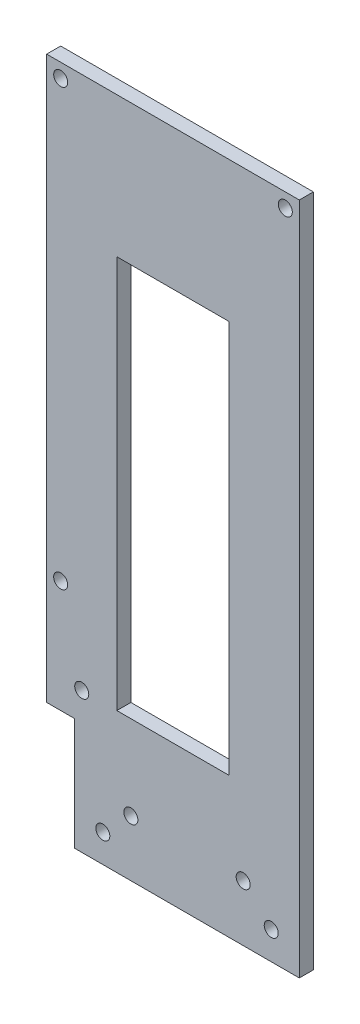
ISO-10303-21;
HEADER;
FILE_DESCRIPTION(('STEP AP214'),'2;1');
FILE_NAME('part.step','',(''),(''),'','','');
FILE_SCHEMA(('AUTOMOTIVE_DESIGN { 1 0 10303 214 1 1 1 1 }'));
ENDSEC;
DATA;
#1=APPLICATION_CONTEXT('core data for automotive mechanical design processes');
#2=APPLICATION_PROTOCOL_DEFINITION('international standard','automotive_design',2000,#1);
#3=PRODUCT_CONTEXT('',#1,'mechanical');
#4=PRODUCT('Part','Part','',(#3));
#5=PRODUCT_RELATED_PRODUCT_CATEGORY('part','',(#4));
#6=PRODUCT_DEFINITION_FORMATION('','',#4);
#7=PRODUCT_DEFINITION_CONTEXT('part definition',#1,'design');
#8=PRODUCT_DEFINITION('design','',#6,#7);
#9=PRODUCT_DEFINITION_SHAPE('','',#8);
#10=(LENGTH_UNIT() NAMED_UNIT(*) SI_UNIT(.MILLI.,.METRE.));
#11=(NAMED_UNIT(*) PLANE_ANGLE_UNIT() SI_UNIT($,.RADIAN.));
#12=(NAMED_UNIT(*) SI_UNIT($,.STERADIAN.) SOLID_ANGLE_UNIT());
#13=UNCERTAINTY_MEASURE_WITH_UNIT(LENGTH_MEASURE(1.E-05),#10,'distance_accuracy_value','');
#14=(GEOMETRIC_REPRESENTATION_CONTEXT(3) GLOBAL_UNCERTAINTY_ASSIGNED_CONTEXT((#13)) GLOBAL_UNIT_ASSIGNED_CONTEXT((#10,
#11,#12)) REPRESENTATION_CONTEXT('',''));
#15=CARTESIAN_POINT('',(0.,0.,0.));
#16=DIRECTION('',(0.,0.,1.));
#17=DIRECTION('',(1.,0.,0.));
#18=AXIS2_PLACEMENT_3D('',#15,#16,#17);
#19=CARTESIAN_POINT('',(0.,0.,10.));
#20=DIRECTION('',(0.,0.,-1.));
#21=DIRECTION('',(-1.,0.,0.));
#22=AXIS2_PLACEMENT_3D('',#19,#20,#21);
#23=PLANE('',#22);
#24=CARTESIAN_POINT('',(-80.,230.,10.));
#25=DIRECTION('',(0.,0.,1.));
#26=DIRECTION('',(1.,0.,0.));
#27=AXIS2_PLACEMENT_3D('',#24,#25,#26);
#28=CIRCLE('',#27,5.00000000000001);
#29=CARTESIAN_POINT('',(-75.,230.,10.));
#30=VERTEX_POINT('',#29);
#31=EDGE_CURVE('E326',#30,#30,#28,.T.);
#32=ORIENTED_EDGE('',*,*,#31,.F.);
#33=EDGE_LOOP('',(#32));
#34=FACE_BOUND('',#33,.T.);
#35=CARTESIAN_POINT('',(50.0000000000001,-200.,10.));
#36=DIRECTION('',(0.,0.,1.));
#37=DIRECTION('',(-1.,0.,0.));
#38=AXIS2_PLACEMENT_3D('',#35,#36,#37);
#39=CIRCLE('',#38,5.);
#40=CARTESIAN_POINT('',(45.0000000000001,-200.,10.));
#41=VERTEX_POINT('',#40);
#42=EDGE_CURVE('E348',#41,#41,#39,.T.);
#43=ORIENTED_EDGE('',*,*,#42,.F.);
#44=EDGE_LOOP('',(#43));
#45=FACE_BOUND('',#44,.T.);
#46=CARTESIAN_POINT('',(70.0000000000001,-220.,10.));
#47=DIRECTION('',(0.,0.,1.));
#48=DIRECTION('',(-1.,0.,0.));
#49=AXIS2_PLACEMENT_3D('',#46,#47,#48);
#50=CIRCLE('',#49,5.00000000000001);
#51=CARTESIAN_POINT('',(65.0000000000001,-220.,10.));
#52=VERTEX_POINT('',#51);
#53=EDGE_CURVE('E347',#52,#52,#50,.T.);
#54=ORIENTED_EDGE('',*,*,#53,.F.);
#55=EDGE_LOOP('',(#54));
#56=FACE_BOUND('',#55,.T.);
#57=CARTESIAN_POINT('',(-29.9999999999999,-200.,10.));
#58=DIRECTION('',(0.,0.,1.));
#59=DIRECTION('',(1.,0.,0.));
#60=AXIS2_PLACEMENT_3D('',#57,#58,#59);
#61=CIRCLE('',#60,5.);
#62=CARTESIAN_POINT('',(-24.9999999999999,-200.,10.));
#63=VERTEX_POINT('',#62);
#64=EDGE_CURVE('E364',#63,#63,#61,.T.);
#65=ORIENTED_EDGE('',*,*,#64,.F.);
#66=EDGE_LOOP('',(#65));
#67=FACE_BOUND('',#66,.T.);
#68=CARTESIAN_POINT('',(80.0000000000001,230.,10.));
#69=DIRECTION('',(0.,0.,1.));
#70=DIRECTION('',(1.,0.,0.));
#71=AXIS2_PLACEMENT_3D('',#68,#69,#70);
#72=CIRCLE('',#71,5.00000000000001);
#73=CARTESIAN_POINT('',(85.0000000000001,230.,10.));
#74=VERTEX_POINT('',#73);
#75=EDGE_CURVE('E319',#74,#74,#72,.T.);
#76=ORIENTED_EDGE('',*,*,#75,.F.);
#77=EDGE_LOOP('',(#76));
#78=FACE_BOUND('',#77,.T.);
#79=CARTESIAN_POINT('',(-80.,-80.,10.));
#80=DIRECTION('',(0.,0.,1.));
#81=DIRECTION('',(1.,0.,0.));
#82=AXIS2_PLACEMENT_3D('',#79,#80,#81);
#83=CIRCLE('',#82,5.00000000000001);
#84=CARTESIAN_POINT('',(-75.,-80.,10.));
#85=VERTEX_POINT('',#84);
#86=EDGE_CURVE('E329',#85,#85,#83,.T.);
#87=ORIENTED_EDGE('',*,*,#86,.F.);
#88=EDGE_LOOP('',(#87));
#89=FACE_BOUND('',#88,.T.);
#90=CARTESIAN_POINT('',(-65.,-140.,10.));
#91=DIRECTION('',(0.,0.,1.));
#92=DIRECTION('',(1.,0.,0.));
#93=AXIS2_PLACEMENT_3D('',#90,#91,#92);
#94=CIRCLE('',#93,5.);
#95=CARTESIAN_POINT('',(-60.,-140.,10.));
#96=VERTEX_POINT('',#95);
#97=EDGE_CURVE('E339',#96,#96,#94,.T.);
#98=ORIENTED_EDGE('',*,*,#97,.F.);
#99=EDGE_LOOP('',(#98));
#100=FACE_BOUND('',#99,.T.);
#101=CARTESIAN_POINT('',(-49.9999999999999,-220.,10.));
#102=DIRECTION('',(0.,0.,1.));
#103=DIRECTION('',(1.,0.,0.));
#104=AXIS2_PLACEMENT_3D('',#101,#102,#103);
#105=CIRCLE('',#104,5.);
#106=CARTESIAN_POINT('',(-44.9999999999999,-220.,10.));
#107=VERTEX_POINT('',#106);
#108=EDGE_CURVE('E363',#107,#107,#105,.T.);
#109=ORIENTED_EDGE('',*,*,#108,.F.);
#110=EDGE_LOOP('',(#109));
#111=FACE_BOUND('',#110,.T.);
#112=DIRECTION('',(0.,1.,0.));
#113=VECTOR('',#112,1.);
#114=CARTESIAN_POINT('',(90.,240.,10.));
#115=LINE('',#114,#113);
#116=CARTESIAN_POINT('',(90.0000000000001,-240.,10.));
#117=VERTEX_POINT('',#116);
#118=CARTESIAN_POINT('',(90.,240.,10.));
#119=VERTEX_POINT('',#118);
#120=EDGE_CURVE('E167',#117,#119,#115,.T.);
#121=ORIENTED_EDGE('',*,*,#120,.T.);
#122=DIRECTION('',(-1.,0.,0.));
#123=VECTOR('',#122,1.);
#124=CARTESIAN_POINT('',(90.,240.,10.));
#125=LINE('',#124,#123);
#126=CARTESIAN_POINT('',(-90.,240.,10.));
#127=VERTEX_POINT('',#126);
#128=EDGE_CURVE('E171',#119,#127,#125,.T.);
#129=ORIENTED_EDGE('',*,*,#128,.T.);
#130=DIRECTION('',(0.,-1.,0.));
#131=VECTOR('',#130,1.);
#132=CARTESIAN_POINT('',(-90.,240.,10.));
#133=LINE('',#132,#131);
#134=CARTESIAN_POINT('',(-89.9999999999999,-160.,10.));
#135=VERTEX_POINT('',#134);
#136=EDGE_CURVE('E175',#127,#135,#133,.T.);
#137=ORIENTED_EDGE('',*,*,#136,.T.);
#138=DIRECTION('',(1.,0.,0.));
#139=VECTOR('',#138,1.);
#140=CARTESIAN_POINT('',(-89.9999999999999,-160.,10.));
#141=LINE('',#140,#139);
#142=CARTESIAN_POINT('',(-69.9999999999999,-160.,10.));
#143=VERTEX_POINT('',#142);
#144=EDGE_CURVE('E178',#135,#143,#141,.T.);
#145=ORIENTED_EDGE('',*,*,#144,.T.);
#146=DIRECTION('',(0.,-1.,0.));
#147=VECTOR('',#146,1.);
#148=CARTESIAN_POINT('',(-69.9999999999999,-160.,10.));
#149=LINE('',#148,#147);
#150=CARTESIAN_POINT('',(-69.9999999999999,-240.,10.));
#151=VERTEX_POINT('',#150);
#152=EDGE_CURVE('E181',#143,#151,#149,.T.);
#153=ORIENTED_EDGE('',*,*,#152,.T.);
#154=DIRECTION('',(1.,0.,0.));
#155=VECTOR('',#154,1.);
#156=CARTESIAN_POINT('',(90.0000000000001,-240.,10.));
#157=LINE('',#156,#155);
#158=EDGE_CURVE('E184',#151,#117,#157,.T.);
#159=ORIENTED_EDGE('',*,*,#158,.T.);
#160=EDGE_LOOP('',(#121,#129,#137,#145,#153,#159));
#161=FACE_BOUND('',#160,.T.);
#162=DIRECTION('',(0.,-1.,0.));
#163=VECTOR('',#162,1.);
#164=CARTESIAN_POINT('',(-39.9999999999999,-140.,10.));
#165=LINE('',#164,#163);
#166=CARTESIAN_POINT('',(-39.9999999999999,140.,10.));
#167=VERTEX_POINT('',#166);
#168=CARTESIAN_POINT('',(-39.9999999999999,-140.,10.));
#169=VERTEX_POINT('',#168);
#170=EDGE_CURVE('E117',#167,#169,#165,.T.);
#171=ORIENTED_EDGE('',*,*,#170,.F.);
#172=DIRECTION('',(-1.,0.,0.));
#173=VECTOR('',#172,1.);
#174=CARTESIAN_POINT('',(40.,140.,10.));
#175=LINE('',#174,#173);
#176=CARTESIAN_POINT('',(40.,140.,10.));
#177=VERTEX_POINT('',#176);
#178=EDGE_CURVE('E143',#177,#167,#175,.T.);
#179=ORIENTED_EDGE('',*,*,#178,.F.);
#180=DIRECTION('',(0.,1.,0.));
#181=VECTOR('',#180,1.);
#182=CARTESIAN_POINT('',(40.0000000000001,-140.,10.));
#183=LINE('',#182,#181);
#184=CARTESIAN_POINT('',(40.0000000000001,-140.,10.));
#185=VERTEX_POINT('',#184);
#186=EDGE_CURVE('E139',#185,#177,#183,.T.);
#187=ORIENTED_EDGE('',*,*,#186,.F.);
#188=DIRECTION('',(1.,0.,0.));
#189=VECTOR('',#188,1.);
#190=CARTESIAN_POINT('',(40.0000000000001,-140.,10.));
#191=LINE('',#190,#189);
#192=EDGE_CURVE('E126',#169,#185,#191,.T.);
#193=ORIENTED_EDGE('',*,*,#192,.F.);
#194=EDGE_LOOP('',(#171,#179,#187,#193));
#195=FACE_BOUND('',#194,.T.);
#196=ADVANCED_FACE('F39',(#34,#45,#56,#67,#78,#89,#100,#111,#161,#195),#23,.F.);
#197=CARTESIAN_POINT('',(0.,0.,0.));
#198=DIRECTION('',(0.,0.,-1.));
#199=DIRECTION('',(-1.,0.,0.));
#200=AXIS2_PLACEMENT_3D('',#197,#198,#199);
#201=PLANE('',#200);
#202=CARTESIAN_POINT('',(-80.,230.,0.));
#203=DIRECTION('',(0.,0.,1.));
#204=DIRECTION('',(1.,0.,0.));
#205=AXIS2_PLACEMENT_3D('',#202,#203,#204);
#206=CIRCLE('',#205,5.00000000000001);
#207=CARTESIAN_POINT('',(-75.,230.,0.));
#208=VERTEX_POINT('',#207);
#209=EDGE_CURVE('E352',#208,#208,#206,.T.);
#210=ORIENTED_EDGE('',*,*,#209,.T.);
#211=EDGE_LOOP('',(#210));
#212=FACE_BOUND('',#211,.T.);
#213=CARTESIAN_POINT('',(50.0000000000001,-200.,0.));
#214=DIRECTION('',(0.,0.,1.));
#215=DIRECTION('',(-1.,0.,0.));
#216=AXIS2_PLACEMENT_3D('',#213,#214,#215);
#217=CIRCLE('',#216,5.);
#218=CARTESIAN_POINT('',(45.0000000000001,-200.,0.));
#219=VERTEX_POINT('',#218);
#220=EDGE_CURVE('E343',#219,#219,#217,.T.);
#221=ORIENTED_EDGE('',*,*,#220,.T.);
#222=EDGE_LOOP('',(#221));
#223=FACE_BOUND('',#222,.T.);
#224=CARTESIAN_POINT('',(70.0000000000001,-220.,0.));
#225=DIRECTION('',(0.,0.,1.));
#226=DIRECTION('',(-1.,0.,0.));
#227=AXIS2_PLACEMENT_3D('',#224,#225,#226);
#228=CIRCLE('',#227,5.00000000000001);
#229=CARTESIAN_POINT('',(65.0000000000001,-220.,0.));
#230=VERTEX_POINT('',#229);
#231=EDGE_CURVE('E368',#230,#230,#228,.T.);
#232=ORIENTED_EDGE('',*,*,#231,.T.);
#233=EDGE_LOOP('',(#232));
#234=FACE_BOUND('',#233,.T.);
#235=CARTESIAN_POINT('',(-29.9999999999999,-200.,0.));
#236=DIRECTION('',(0.,0.,1.));
#237=DIRECTION('',(1.,0.,0.));
#238=AXIS2_PLACEMENT_3D('',#235,#236,#237);
#239=CIRCLE('',#238,5.);
#240=CARTESIAN_POINT('',(-24.9999999999999,-200.,0.));
#241=VERTEX_POINT('',#240);
#242=EDGE_CURVE('E359',#241,#241,#239,.T.);
#243=ORIENTED_EDGE('',*,*,#242,.T.);
#244=EDGE_LOOP('',(#243));
#245=FACE_BOUND('',#244,.T.);
#246=CARTESIAN_POINT('',(80.0000000000001,230.,0.));
#247=DIRECTION('',(0.,0.,1.));
#248=DIRECTION('',(1.,0.,0.));
#249=AXIS2_PLACEMENT_3D('',#246,#247,#248);
#250=CIRCLE('',#249,5.00000000000001);
#251=CARTESIAN_POINT('',(85.0000000000001,230.,0.));
#252=VERTEX_POINT('',#251);
#253=EDGE_CURVE('E316',#252,#252,#250,.T.);
#254=ORIENTED_EDGE('',*,*,#253,.T.);
#255=EDGE_LOOP('',(#254));
#256=FACE_BOUND('',#255,.T.);
#257=CARTESIAN_POINT('',(-80.,-80.,0.));
#258=DIRECTION('',(0.,0.,1.));
#259=DIRECTION('',(1.,0.,0.));
#260=AXIS2_PLACEMENT_3D('',#257,#258,#259);
#261=CIRCLE('',#260,5.00000000000001);
#262=CARTESIAN_POINT('',(-75.,-80.,0.));
#263=VERTEX_POINT('',#262);
#264=EDGE_CURVE('E322',#263,#263,#261,.T.);
#265=ORIENTED_EDGE('',*,*,#264,.T.);
#266=EDGE_LOOP('',(#265));
#267=FACE_BOUND('',#266,.T.);
#268=CARTESIAN_POINT('',(-65.,-140.,0.));
#269=DIRECTION('',(0.,0.,1.));
#270=DIRECTION('',(1.,0.,0.));
#271=AXIS2_PLACEMENT_3D('',#268,#269,#270);
#272=CIRCLE('',#271,5.);
#273=CARTESIAN_POINT('',(-60.,-140.,0.));
#274=VERTEX_POINT('',#273);
#275=EDGE_CURVE('E335',#274,#274,#272,.T.);
#276=ORIENTED_EDGE('',*,*,#275,.T.);
#277=EDGE_LOOP('',(#276));
#278=FACE_BOUND('',#277,.T.);
#279=CARTESIAN_POINT('',(-49.9999999999999,-220.,0.));
#280=DIRECTION('',(0.,0.,1.));
#281=DIRECTION('',(1.,0.,0.));
#282=AXIS2_PLACEMENT_3D('',#279,#280,#281);
#283=CIRCLE('',#282,5.);
#284=CARTESIAN_POINT('',(-44.9999999999999,-220.,0.));
#285=VERTEX_POINT('',#284);
#286=EDGE_CURVE('E151',#285,#285,#283,.T.);
#287=ORIENTED_EDGE('',*,*,#286,.T.);
#288=EDGE_LOOP('',(#287));
#289=FACE_BOUND('',#288,.T.);
#290=DIRECTION('',(0.,1.,0.));
#291=VECTOR('',#290,1.);
#292=CARTESIAN_POINT('',(90.,240.,0.));
#293=LINE('',#292,#291);
#294=CARTESIAN_POINT('',(90.0000000000001,-240.,0.));
#295=VERTEX_POINT('',#294);
#296=CARTESIAN_POINT('',(90.,240.,0.));
#297=VERTEX_POINT('',#296);
#298=EDGE_CURVE('E135',#295,#297,#293,.T.);
#299=ORIENTED_EDGE('',*,*,#298,.F.);
#300=DIRECTION('',(1.,0.,0.));
#301=VECTOR('',#300,1.);
#302=CARTESIAN_POINT('',(90.0000000000001,-240.,0.));
#303=LINE('',#302,#301);
#304=CARTESIAN_POINT('',(-69.9999999999999,-240.,0.));
#305=VERTEX_POINT('',#304);
#306=EDGE_CURVE('E172',#305,#295,#303,.T.);
#307=ORIENTED_EDGE('',*,*,#306,.F.);
#308=DIRECTION('',(0.,-1.,0.));
#309=VECTOR('',#308,1.);
#310=CARTESIAN_POINT('',(-69.9999999999999,-160.,0.));
#311=LINE('',#310,#309);
#312=CARTESIAN_POINT('',(-69.9999999999999,-160.,0.));
#313=VERTEX_POINT('',#312);
#314=EDGE_CURVE('E200',#313,#305,#311,.T.);
#315=ORIENTED_EDGE('',*,*,#314,.F.);
#316=DIRECTION('',(1.,0.,0.));
#317=VECTOR('',#316,1.);
#318=CARTESIAN_POINT('',(-89.9999999999999,-160.,0.));
#319=LINE('',#318,#317);
#320=CARTESIAN_POINT('',(-89.9999999999999,-160.,0.));
#321=VERTEX_POINT('',#320);
#322=EDGE_CURVE('E197',#321,#313,#319,.T.);
#323=ORIENTED_EDGE('',*,*,#322,.F.);
#324=DIRECTION('',(0.,-1.,0.));
#325=VECTOR('',#324,1.);
#326=CARTESIAN_POINT('',(-90.,240.,0.));
#327=LINE('',#326,#325);
#328=CARTESIAN_POINT('',(-90.,240.,0.));
#329=VERTEX_POINT('',#328);
#330=EDGE_CURVE('E194',#329,#321,#327,.T.);
#331=ORIENTED_EDGE('',*,*,#330,.F.);
#332=DIRECTION('',(-1.,0.,0.));
#333=VECTOR('',#332,1.);
#334=CARTESIAN_POINT('',(90.,240.,0.));
#335=LINE('',#334,#333);
#336=EDGE_CURVE('E191',#297,#329,#335,.T.);
#337=ORIENTED_EDGE('',*,*,#336,.F.);
#338=EDGE_LOOP('',(#299,#307,#315,#323,#331,#337));
#339=FACE_BOUND('',#338,.T.);
#340=DIRECTION('',(-1.,0.,0.));
#341=VECTOR('',#340,1.);
#342=CARTESIAN_POINT('',(40.,140.,0.));
#343=LINE('',#342,#341);
#344=CARTESIAN_POINT('',(40.,140.,0.));
#345=VERTEX_POINT('',#344);
#346=CARTESIAN_POINT('',(-39.9999999999999,140.,0.));
#347=VERTEX_POINT('',#346);
#348=EDGE_CURVE('E127',#345,#347,#343,.T.);
#349=ORIENTED_EDGE('',*,*,#348,.T.);
#350=DIRECTION('',(0.,-1.,0.));
#351=VECTOR('',#350,1.);
#352=CARTESIAN_POINT('',(-39.9999999999999,-140.,0.));
#353=LINE('',#352,#351);
#354=CARTESIAN_POINT('',(-39.9999999999999,-140.,0.));
#355=VERTEX_POINT('',#354);
#356=EDGE_CURVE('E63',#347,#355,#353,.T.);
#357=ORIENTED_EDGE('',*,*,#356,.T.);
#358=DIRECTION('',(1.,0.,0.));
#359=VECTOR('',#358,1.);
#360=CARTESIAN_POINT('',(40.0000000000001,-140.,0.));
#361=LINE('',#360,#359);
#362=CARTESIAN_POINT('',(40.0000000000001,-140.,0.));
#363=VERTEX_POINT('',#362);
#364=EDGE_CURVE('E133',#355,#363,#361,.T.);
#365=ORIENTED_EDGE('',*,*,#364,.T.);
#366=DIRECTION('',(0.,1.,0.));
#367=VECTOR('',#366,1.);
#368=CARTESIAN_POINT('',(40.0000000000001,-140.,0.));
#369=LINE('',#368,#367);
#370=EDGE_CURVE('E154',#363,#345,#369,.T.);
#371=ORIENTED_EDGE('',*,*,#370,.T.);
#372=EDGE_LOOP('',(#349,#357,#365,#371));
#373=FACE_BOUND('',#372,.T.);
#374=ADVANCED_FACE('F231',(#212,#223,#234,#245,#256,#267,#278,#289,#339,#373),#201,.T.);
#375=CARTESIAN_POINT('',(90.,240.,10.));
#376=DIRECTION('',(-1.,0.,0.));
#377=DIRECTION('',(0.,-1.,0.));
#378=AXIS2_PLACEMENT_3D('',#375,#376,#377);
#379=PLANE('',#378);
#380=ORIENTED_EDGE('',*,*,#298,.T.);
#381=DIRECTION('',(0.,0.,-1.));
#382=VECTOR('',#381,1.);
#383=CARTESIAN_POINT('',(90.,240.,10.));
#384=LINE('',#383,#382);
#385=EDGE_CURVE('E11',#119,#297,#384,.T.);
#386=ORIENTED_EDGE('',*,*,#385,.F.);
#387=ORIENTED_EDGE('',*,*,#120,.F.);
#388=DIRECTION('',(0.,0.,-1.));
#389=VECTOR('',#388,1.);
#390=CARTESIAN_POINT('',(90.0000000000001,-240.,10.));
#391=LINE('',#390,#389);
#392=EDGE_CURVE('E187',#117,#295,#391,.T.);
#393=ORIENTED_EDGE('',*,*,#392,.T.);
#394=EDGE_LOOP('',(#380,#386,#387,#393));
#395=FACE_BOUND('',#394,.T.);
#396=ADVANCED_FACE('F41',(#395),#379,.F.);
#397=CARTESIAN_POINT('',(90.,240.,10.));
#398=DIRECTION('',(0.,-1.,0.));
#399=DIRECTION('',(0.,0.,-1.));
#400=AXIS2_PLACEMENT_3D('',#397,#398,#399);
#401=PLANE('',#400);
#402=ORIENTED_EDGE('',*,*,#336,.T.);
#403=DIRECTION('',(0.,0.,-1.));
#404=VECTOR('',#403,1.);
#405=CARTESIAN_POINT('',(-90.,240.,10.));
#406=LINE('',#405,#404);
#407=EDGE_CURVE('E48',#127,#329,#406,.T.);
#408=ORIENTED_EDGE('',*,*,#407,.F.);
#409=ORIENTED_EDGE('',*,*,#128,.F.);
#410=ORIENTED_EDGE('',*,*,#385,.T.);
#411=EDGE_LOOP('',(#402,#408,#409,#410));
#412=FACE_BOUND('',#411,.T.);
#413=ADVANCED_FACE('F248',(#412),#401,.F.);
#414=CARTESIAN_POINT('',(-90.,240.,10.));
#415=DIRECTION('',(1.,0.,0.));
#416=DIRECTION('',(0.,1.,0.));
#417=AXIS2_PLACEMENT_3D('',#414,#415,#416);
#418=PLANE('',#417);
#419=ORIENTED_EDGE('',*,*,#330,.T.);
#420=DIRECTION('',(0.,0.,-1.));
#421=VECTOR('',#420,1.);
#422=CARTESIAN_POINT('',(-89.9999999999999,-160.,10.));
#423=LINE('',#422,#421);
#424=EDGE_CURVE('E216',#135,#321,#423,.T.);
#425=ORIENTED_EDGE('',*,*,#424,.F.);
#426=ORIENTED_EDGE('',*,*,#136,.F.);
#427=ORIENTED_EDGE('',*,*,#407,.T.);
#428=EDGE_LOOP('',(#419,#425,#426,#427));
#429=FACE_BOUND('',#428,.T.);
#430=ADVANCED_FACE('F225',(#429),#418,.F.);
#431=CARTESIAN_POINT('',(-89.9999999999999,-160.,10.));
#432=DIRECTION('',(0.,1.,0.));
#433=DIRECTION('',(0.,0.,1.));
#434=AXIS2_PLACEMENT_3D('',#431,#432,#433);
#435=PLANE('',#434);
#436=ORIENTED_EDGE('',*,*,#322,.T.);
#437=DIRECTION('',(0.,0.,-1.));
#438=VECTOR('',#437,1.);
#439=CARTESIAN_POINT('',(-69.9999999999999,-160.,10.));
#440=LINE('',#439,#438);
#441=EDGE_CURVE('E212',#143,#313,#440,.T.);
#442=ORIENTED_EDGE('',*,*,#441,.F.);
#443=ORIENTED_EDGE('',*,*,#144,.F.);
#444=ORIENTED_EDGE('',*,*,#424,.T.);
#445=EDGE_LOOP('',(#436,#442,#443,#444));
#446=FACE_BOUND('',#445,.T.);
#447=ADVANCED_FACE('F237',(#446),#435,.F.);
#448=CARTESIAN_POINT('',(-69.9999999999999,-160.,10.));
#449=DIRECTION('',(1.,0.,0.));
#450=DIRECTION('',(0.,1.,0.));
#451=AXIS2_PLACEMENT_3D('',#448,#449,#450);
#452=PLANE('',#451);
#453=ORIENTED_EDGE('',*,*,#314,.T.);
#454=DIRECTION('',(0.,0.,-1.));
#455=VECTOR('',#454,1.);
#456=CARTESIAN_POINT('',(-69.9999999999999,-240.,10.));
#457=LINE('',#456,#455);
#458=EDGE_CURVE('E208',#151,#305,#457,.T.);
#459=ORIENTED_EDGE('',*,*,#458,.F.);
#460=ORIENTED_EDGE('',*,*,#152,.F.);
#461=ORIENTED_EDGE('',*,*,#441,.T.);
#462=EDGE_LOOP('',(#453,#459,#460,#461));
#463=FACE_BOUND('',#462,.T.);
#464=ADVANCED_FACE('F241',(#463),#452,.F.);
#465=CARTESIAN_POINT('',(90.0000000000001,-240.,10.));
#466=DIRECTION('',(0.,1.,0.));
#467=DIRECTION('',(0.,0.,1.));
#468=AXIS2_PLACEMENT_3D('',#465,#466,#467);
#469=PLANE('',#468);
#470=ORIENTED_EDGE('',*,*,#306,.T.);
#471=ORIENTED_EDGE('',*,*,#392,.F.);
#472=ORIENTED_EDGE('',*,*,#158,.F.);
#473=ORIENTED_EDGE('',*,*,#458,.T.);
#474=EDGE_LOOP('',(#470,#471,#472,#473));
#475=FACE_BOUND('',#474,.T.);
#476=ADVANCED_FACE('F251',(#475),#469,.F.);
#477=CARTESIAN_POINT('',(-39.9999999999999,-140.,10.));
#478=DIRECTION('',(1.,0.,0.));
#479=DIRECTION('',(0.,1.,0.));
#480=AXIS2_PLACEMENT_3D('',#477,#478,#479);
#481=PLANE('',#480);
#482=ORIENTED_EDGE('',*,*,#356,.F.);
#483=DIRECTION('',(0.,0.,-1.));
#484=VECTOR('',#483,1.);
#485=CARTESIAN_POINT('',(-39.9999999999999,140.,10.));
#486=LINE('',#485,#484);
#487=EDGE_CURVE('E121',#167,#347,#486,.T.);
#488=ORIENTED_EDGE('',*,*,#487,.F.);
#489=ORIENTED_EDGE('',*,*,#170,.T.);
#490=DIRECTION('',(0.,0.,-1.));
#491=VECTOR('',#490,1.);
#492=CARTESIAN_POINT('',(-39.9999999999999,-140.,10.));
#493=LINE('',#492,#491);
#494=EDGE_CURVE('E120',#169,#355,#493,.T.);
#495=ORIENTED_EDGE('',*,*,#494,.T.);
#496=EDGE_LOOP('',(#482,#488,#489,#495));
#497=FACE_BOUND('',#496,.T.);
#498=ADVANCED_FACE('F119',(#497),#481,.T.);
#499=CARTESIAN_POINT('',(40.0000000000001,-140.,10.));
#500=DIRECTION('',(0.,1.,0.));
#501=DIRECTION('',(-1.,0.,0.));
#502=AXIS2_PLACEMENT_3D('',#499,#500,#501);
#503=PLANE('',#502);
#504=ORIENTED_EDGE('',*,*,#364,.F.);
#505=ORIENTED_EDGE('',*,*,#494,.F.);
#506=ORIENTED_EDGE('',*,*,#192,.T.);
#507=DIRECTION('',(0.,0.,-1.));
#508=VECTOR('',#507,1.);
#509=CARTESIAN_POINT('',(40.0000000000001,-140.,10.));
#510=LINE('',#509,#508);
#511=EDGE_CURVE('E136',#185,#363,#510,.T.);
#512=ORIENTED_EDGE('',*,*,#511,.T.);
#513=EDGE_LOOP('',(#504,#505,#506,#512));
#514=FACE_BOUND('',#513,.T.);
#515=ADVANCED_FACE('F130',(#514),#503,.T.);
#516=CARTESIAN_POINT('',(40.0000000000001,-140.,10.));
#517=DIRECTION('',(-1.,0.,0.));
#518=DIRECTION('',(0.,-1.,0.));
#519=AXIS2_PLACEMENT_3D('',#516,#517,#518);
#520=PLANE('',#519);
#521=ORIENTED_EDGE('',*,*,#370,.F.);
#522=ORIENTED_EDGE('',*,*,#511,.F.);
#523=ORIENTED_EDGE('',*,*,#186,.T.);
#524=DIRECTION('',(0.,0.,-1.));
#525=VECTOR('',#524,1.);
#526=CARTESIAN_POINT('',(40.,140.,10.));
#527=LINE('',#526,#525);
#528=EDGE_CURVE('E55',#177,#345,#527,.T.);
#529=ORIENTED_EDGE('',*,*,#528,.T.);
#530=EDGE_LOOP('',(#521,#522,#523,#529));
#531=FACE_BOUND('',#530,.T.);
#532=ADVANCED_FACE('F273',(#531),#520,.T.);
#533=CARTESIAN_POINT('',(40.,140.,10.));
#534=DIRECTION('',(0.,-1.,0.));
#535=DIRECTION('',(0.,0.,-1.));
#536=AXIS2_PLACEMENT_3D('',#533,#534,#535);
#537=PLANE('',#536);
#538=ORIENTED_EDGE('',*,*,#348,.F.);
#539=ORIENTED_EDGE('',*,*,#528,.F.);
#540=ORIENTED_EDGE('',*,*,#178,.T.);
#541=ORIENTED_EDGE('',*,*,#487,.T.);
#542=EDGE_LOOP('',(#538,#539,#540,#541));
#543=FACE_BOUND('',#542,.T.);
#544=ADVANCED_FACE('F276',(#543),#537,.T.);
#545=CARTESIAN_POINT('',(-49.9999999999999,-220.,0.));
#546=DIRECTION('',(0.,0.,1.));
#547=DIRECTION('',(1.,0.,0.));
#548=AXIS2_PLACEMENT_3D('',#545,#546,#547);
#549=CYLINDRICAL_SURFACE('',#548,5.);
#550=ORIENTED_EDGE('',*,*,#286,.F.);
#551=EDGE_LOOP('',(#550));
#552=FACE_BOUND('',#551,.T.);
#553=ORIENTED_EDGE('',*,*,#108,.T.);
#554=EDGE_LOOP('',(#553));
#555=FACE_BOUND('',#554,.T.);
#556=ADVANCED_FACE('F280',(#552,#555),#549,.F.);
#557=CARTESIAN_POINT('',(-65.,-140.,0.));
#558=DIRECTION('',(0.,0.,1.));
#559=DIRECTION('',(1.,0.,0.));
#560=AXIS2_PLACEMENT_3D('',#557,#558,#559);
#561=CYLINDRICAL_SURFACE('',#560,5.);
#562=ORIENTED_EDGE('',*,*,#275,.F.);
#563=EDGE_LOOP('',(#562));
#564=FACE_BOUND('',#563,.T.);
#565=ORIENTED_EDGE('',*,*,#97,.T.);
#566=EDGE_LOOP('',(#565));
#567=FACE_BOUND('',#566,.T.);
#568=ADVANCED_FACE('F283',(#564,#567),#561,.F.);
#569=CARTESIAN_POINT('',(-80.,-80.,0.));
#570=DIRECTION('',(0.,0.,1.));
#571=DIRECTION('',(1.,0.,0.));
#572=AXIS2_PLACEMENT_3D('',#569,#570,#571);
#573=CYLINDRICAL_SURFACE('',#572,5.00000000000001);
#574=ORIENTED_EDGE('',*,*,#264,.F.);
#575=EDGE_LOOP('',(#574));
#576=FACE_BOUND('',#575,.T.);
#577=ORIENTED_EDGE('',*,*,#86,.T.);
#578=EDGE_LOOP('',(#577));
#579=FACE_BOUND('',#578,.T.);
#580=ADVANCED_FACE('F304',(#576,#579),#573,.F.);
#581=CARTESIAN_POINT('',(80.0000000000001,230.,0.));
#582=DIRECTION('',(0.,0.,1.));
#583=DIRECTION('',(1.,0.,0.));
#584=AXIS2_PLACEMENT_3D('',#581,#582,#583);
#585=CYLINDRICAL_SURFACE('',#584,5.00000000000001);
#586=ORIENTED_EDGE('',*,*,#253,.F.);
#587=EDGE_LOOP('',(#586));
#588=FACE_BOUND('',#587,.T.);
#589=ORIENTED_EDGE('',*,*,#75,.T.);
#590=EDGE_LOOP('',(#589));
#591=FACE_BOUND('',#590,.T.);
#592=ADVANCED_FACE('F293',(#588,#591),#585,.F.);
#593=CARTESIAN_POINT('',(-29.9999999999999,-200.,0.));
#594=DIRECTION('',(0.,0.,1.));
#595=DIRECTION('',(1.,0.,0.));
#596=AXIS2_PLACEMENT_3D('',#593,#594,#595);
#597=CYLINDRICAL_SURFACE('',#596,5.);
#598=ORIENTED_EDGE('',*,*,#242,.F.);
#599=EDGE_LOOP('',(#598));
#600=FACE_BOUND('',#599,.T.);
#601=ORIENTED_EDGE('',*,*,#64,.T.);
#602=EDGE_LOOP('',(#601));
#603=FACE_BOUND('',#602,.T.);
#604=ADVANCED_FACE('F289',(#600,#603),#597,.F.);
#605=CARTESIAN_POINT('',(70.0000000000001,-220.,0.));
#606=DIRECTION('',(0.,0.,1.));
#607=DIRECTION('',(1.,0.,0.));
#608=AXIS2_PLACEMENT_3D('',#605,#606,#607);
#609=CYLINDRICAL_SURFACE('',#608,5.00000000000001);
#610=ORIENTED_EDGE('',*,*,#231,.F.);
#611=EDGE_LOOP('',(#610));
#612=FACE_BOUND('',#611,.T.);
#613=ORIENTED_EDGE('',*,*,#53,.T.);
#614=EDGE_LOOP('',(#613));
#615=FACE_BOUND('',#614,.T.);
#616=ADVANCED_FACE('F285',(#612,#615),#609,.F.);
#617=CARTESIAN_POINT('',(50.0000000000001,-200.,0.));
#618=DIRECTION('',(0.,0.,1.));
#619=DIRECTION('',(1.,0.,0.));
#620=AXIS2_PLACEMENT_3D('',#617,#618,#619);
#621=CYLINDRICAL_SURFACE('',#620,5.);
#622=ORIENTED_EDGE('',*,*,#220,.F.);
#623=EDGE_LOOP('',(#622));
#624=FACE_BOUND('',#623,.T.);
#625=ORIENTED_EDGE('',*,*,#42,.T.);
#626=EDGE_LOOP('',(#625));
#627=FACE_BOUND('',#626,.T.);
#628=ADVANCED_FACE('F288',(#624,#627),#621,.F.);
#629=CARTESIAN_POINT('',(-80.,230.,0.));
#630=DIRECTION('',(0.,0.,1.));
#631=DIRECTION('',(1.,0.,0.));
#632=AXIS2_PLACEMENT_3D('',#629,#630,#631);
#633=CYLINDRICAL_SURFACE('',#632,5.00000000000001);
#634=ORIENTED_EDGE('',*,*,#209,.F.);
#635=EDGE_LOOP('',(#634));
#636=FACE_BOUND('',#635,.T.);
#637=ORIENTED_EDGE('',*,*,#31,.T.);
#638=EDGE_LOOP('',(#637));
#639=FACE_BOUND('',#638,.T.);
#640=ADVANCED_FACE('F295',(#636,#639),#633,.F.);
#641=CLOSED_SHELL('',(#196,#374,#396,#413,#430,#447,#464,#476,#498,#515,#532,#544,#556,#568,
#580,#592,#604,#616,#628,#640));
#642=MANIFOLD_SOLID_BREP('B2',#641);
#643=ADVANCED_BREP_SHAPE_REPRESENTATION('',(#18,#642),#14);
#644=SHAPE_DEFINITION_REPRESENTATION(#9,#643);
ENDSEC;
END-ISO-10303-21;
